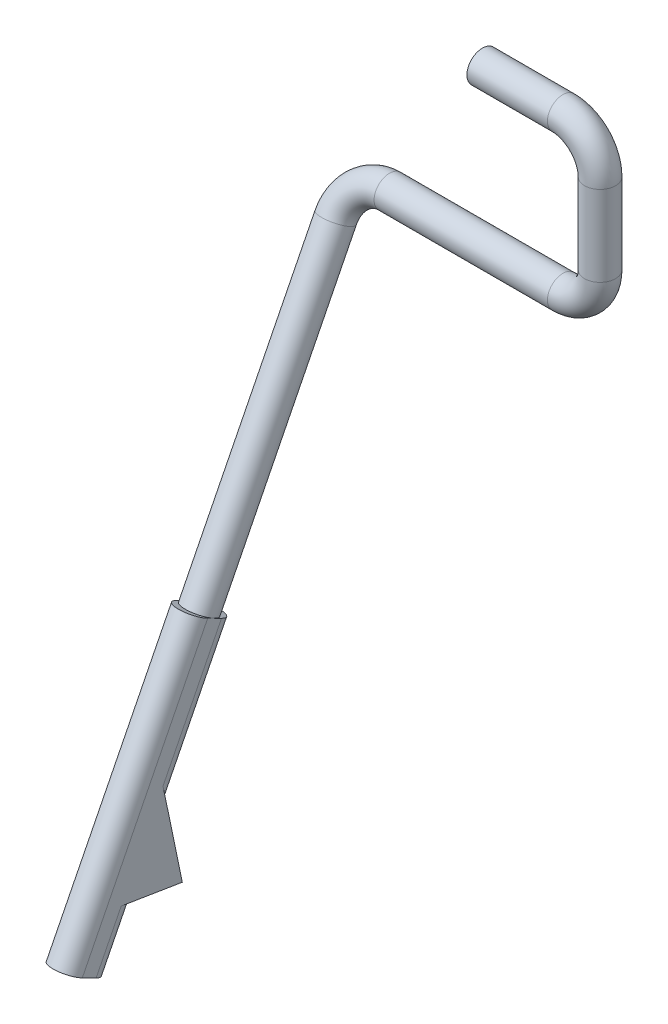
ISO-10303-21;
HEADER;
FILE_DESCRIPTION(('STEP AP214'),'2;1');
FILE_NAME('part.step','',(''),(''),'','','');
FILE_SCHEMA(('AUTOMOTIVE_DESIGN { 1 0 10303 214 1 1 1 1 }'));
ENDSEC;
DATA;
#1=APPLICATION_CONTEXT('core data for automotive mechanical design processes');
#2=APPLICATION_PROTOCOL_DEFINITION('international standard','automotive_design',2000,#1);
#3=PRODUCT_CONTEXT('',#1,'mechanical');
#4=PRODUCT('Part','Part','',(#3));
#5=PRODUCT_RELATED_PRODUCT_CATEGORY('part','',(#4));
#6=PRODUCT_DEFINITION_FORMATION('','',#4);
#7=PRODUCT_DEFINITION_CONTEXT('part definition',#1,'design');
#8=PRODUCT_DEFINITION('design','',#6,#7);
#9=PRODUCT_DEFINITION_SHAPE('','',#8);
#10=(LENGTH_UNIT() NAMED_UNIT(*) SI_UNIT(.MILLI.,.METRE.));
#11=(NAMED_UNIT(*) PLANE_ANGLE_UNIT() SI_UNIT($,.RADIAN.));
#12=(NAMED_UNIT(*) SI_UNIT($,.STERADIAN.) SOLID_ANGLE_UNIT());
#13=UNCERTAINTY_MEASURE_WITH_UNIT(LENGTH_MEASURE(1.E-05),#10,'distance_accuracy_value','');
#14=(GEOMETRIC_REPRESENTATION_CONTEXT(3) GLOBAL_UNCERTAINTY_ASSIGNED_CONTEXT((#13)) GLOBAL_UNIT_ASSIGNED_CONTEXT((#10,
#11,#12)) REPRESENTATION_CONTEXT('',''));
#15=CARTESIAN_POINT('',(0.,0.,0.));
#16=DIRECTION('',(0.,0.,1.));
#17=DIRECTION('',(1.,0.,0.));
#18=AXIS2_PLACEMENT_3D('',#15,#16,#17);
#19=CARTESIAN_POINT('',(-34.,-74.6790705236024,23.6337143062818));
#20=DIRECTION('',(0.,-0.893028554974588,0.45));
#21=DIRECTION('',(0.,-0.45,-0.893028554974588));
#22=AXIS2_PLACEMENT_3D('',#19,#20,#21);
#23=CYLINDRICAL_SURFACE('',#22,2.5);
#24=CARTESIAN_POINT('',(-34.,-106.828098502688,39.8337143062818));
#25=DIRECTION('',(0.,-0.987042804231733,0.160457167538121));
#26=DIRECTION('',(0.,0.160457167538121,0.987042804231733));
#27=AXIS2_PLACEMENT_3D('',#24,#25,#26);
#28=ELLIPSE('',#27,2.62147073680378,2.5);
#29=CARTESIAN_POINT('',(-31.5,-106.828098502688,39.8337143062818));
#30=VERTEX_POINT('',#29);
#31=CARTESIAN_POINT('',(-36.5,-106.828098502688,39.8337143062818));
#32=VERTEX_POINT('',#31);
#33=EDGE_CURVE('E11',#30,#32,#28,.F.);
#34=ORIENTED_EDGE('',*,*,#33,.F.);
#35=DIRECTION('',(0.,-0.893028554974588,0.45));
#36=VECTOR('',#35,1.);
#37=CARTESIAN_POINT('',(-31.5,-74.6790705236024,23.6337143062818));
#38=LINE('',#37,#36);
#39=CARTESIAN_POINT('',(-31.5,-114.865355497459,43.8837143062818));
#40=VERTEX_POINT('',#39);
#41=EDGE_CURVE('E185',#30,#40,#38,.T.);
#42=ORIENTED_EDGE('',*,*,#41,.T.);
#43=CARTESIAN_POINT('',(-34.,-114.865355497459,43.8837143062818));
#44=DIRECTION('',(0.,-0.893028554974587,0.450000000000001));
#45=DIRECTION('',(0.,-0.450000000000001,-0.893028554974587));
#46=AXIS2_PLACEMENT_3D('',#43,#44,#45);
#47=CIRCLE('',#46,2.5);
#48=CARTESIAN_POINT('',(-36.5,-114.865355497459,43.8837143062818));
#49=VERTEX_POINT('',#48);
#50=EDGE_CURVE('E178',#49,#40,#47,.T.);
#51=ORIENTED_EDGE('',*,*,#50,.F.);
#52=DIRECTION('',(0.,-0.893028554974588,0.45));
#53=VECTOR('',#52,1.);
#54=CARTESIAN_POINT('',(-36.5,-74.6790705236024,23.6337143062818));
#55=LINE('',#54,#53);
#56=EDGE_CURVE('E75',#32,#49,#55,.T.);
#57=ORIENTED_EDGE('',*,*,#56,.F.);
#58=EDGE_LOOP('',(#34,#42,#51,#57));
#59=FACE_BOUND('',#58,.T.);
#60=ADVANCED_FACE('F51',(#59),#23,.T.);
#61=CARTESIAN_POINT('',(-34.,-114.302855497459,45.));
#62=DIRECTION('',(0.,0.893028554974588,-0.45));
#63=DIRECTION('',(0.,0.45,0.893028554974588));
#64=AXIS2_PLACEMENT_3D('',#61,#62,#63);
#65=CYLINDRICAL_SURFACE('',#64,2.5);
#66=CARTESIAN_POINT('',(-34.,-30.3581713298475,2.70000000000001));
#67=DIRECTION('',(0.,-0.893028554974588,0.45));
#68=DIRECTION('',(-0.449999999999999,-0.401862849738565,-0.797500000000001));
#69=AXIS2_PLACEMENT_3D('',#66,#67,#68);
#70=CIRCLE('',#69,2.5);
#71=CARTESIAN_POINT('',(-36.5,-30.3581713298475,2.70000000000001));
#72=VERTEX_POINT('',#71);
#73=EDGE_CURVE('E184',#72,#72,#70,.T.);
#74=ORIENTED_EDGE('',*,*,#73,.T.);
#75=EDGE_LOOP('',(#74));
#76=FACE_BOUND('',#75,.T.);
#77=CARTESIAN_POINT('',(-34.,-74.1165705236024,24.75));
#78=DIRECTION('',(0.,-0.893028554974587,0.450000000000001));
#79=DIRECTION('',(0.,-0.450000000000001,-0.893028554974587));
#80=AXIS2_PLACEMENT_3D('',#77,#78,#79);
#81=CIRCLE('',#80,2.5);
#82=CARTESIAN_POINT('',(-31.5,-74.1165705236024,24.75));
#83=VERTEX_POINT('',#82);
#84=CARTESIAN_POINT('',(-36.5,-74.1165705236024,24.75));
#85=VERTEX_POINT('',#84);
#86=EDGE_CURVE('E223',#83,#85,#81,.T.);
#87=ORIENTED_EDGE('',*,*,#86,.F.);
#88=EDGE_CURVE('E220',#85,#83,#81,.T.);
#89=ORIENTED_EDGE('',*,*,#88,.F.);
#90=EDGE_LOOP('',(#87,#89));
#91=FACE_BOUND('',#90,.T.);
#92=ADVANCED_FACE('F288',(#76,#91),#65,.T.);
#93=CARTESIAN_POINT('',(-13.,0.,0.));
#94=DIRECTION('',(1.,0.,0.));
#95=DIRECTION('',(0.,0.,-1.));
#96=AXIS2_PLACEMENT_3D('',#93,#94,#95);
#97=PLANE('',#96);
#98=CARTESIAN_POINT('',(-13.,0.,0.));
#99=DIRECTION('',(1.,0.,0.));
#100=DIRECTION('',(0.,0.,-1.));
#101=AXIS2_PLACEMENT_3D('',#98,#99,#100);
#102=CIRCLE('',#101,2.5);
#103=CARTESIAN_POINT('',(-13.,0.,-2.5));
#104=VERTEX_POINT('',#103);
#105=EDGE_CURVE('E216',#104,#104,#102,.T.);
#106=ORIENTED_EDGE('',*,*,#105,.F.);
#107=EDGE_LOOP('',(#106));
#108=FACE_BOUND('',#107,.T.);
#109=ADVANCED_FACE('F295',(#108),#97,.F.);
#110=CARTESIAN_POINT('',(-28.,-30.3581713298475,2.7));
#111=DIRECTION('',(0.,-0.449999999999998,-0.893028554974588));
#112=DIRECTION('',(0.,0.893028554974589,-0.449999999999999));
#113=AXIS2_PLACEMENT_3D('',#110,#111,#112);
#114=TOROIDAL_SURFACE('',#113,6.,2.5);
#115=CARTESIAN_POINT('',(-28.,-25.,0.));
#116=DIRECTION('',(-1.,0.,0.));
#117=DIRECTION('',(0.,0.,-1.));
#118=AXIS2_PLACEMENT_3D('',#115,#116,#117);
#119=CIRCLE('',#118,2.5);
#120=CARTESIAN_POINT('',(-28.,-22.7674286125635,-1.12499999999998));
#121=VERTEX_POINT('',#120);
#122=EDGE_CURVE('E196',#121,#121,#119,.T.);
#123=CARTESIAN_POINT('',(-28.,-30.3581713298475,2.7));
#124=DIRECTION('',(0.,-0.449999999999998,-0.893028554974588));
#125=DIRECTION('',(0.,0.893028554974589,-0.449999999999999));
#126=AXIS2_PLACEMENT_3D('',#123,#124,#125);
#127=CIRCLE('',#126,8.5);
#128=EDGE_CURVE('',#72,#121,#127,.T.);
#129=ORIENTED_EDGE('',*,*,#73,.F.);
#130=ORIENTED_EDGE('',*,*,#122,.T.);
#131=ORIENTED_EDGE('',*,*,#128,.T.);
#132=ORIENTED_EDGE('',*,*,#128,.F.);
#133=EDGE_LOOP('',(#129,#131,#130,#132));
#134=FACE_BOUND('',#133,.T.);
#135=ADVANCED_FACE('F430',(#134),#114,.T.);
#136=CARTESIAN_POINT('',(-28.,-25.,0.));
#137=DIRECTION('',(1.,0.,0.));
#138=DIRECTION('',(0.,0.,-1.));
#139=AXIS2_PLACEMENT_3D('',#136,#137,#138);
#140=CYLINDRICAL_SURFACE('',#139,2.5);
#141=CARTESIAN_POINT('',(0.,-25.,0.));
#142=DIRECTION('',(-1.,0.,0.));
#143=DIRECTION('',(0.,0.,-1.));
#144=AXIS2_PLACEMENT_3D('',#141,#142,#143);
#145=CIRCLE('',#144,2.5);
#146=CARTESIAN_POINT('',(0.,-27.5,0.));
#147=VERTEX_POINT('',#146);
#148=EDGE_CURVE('E200',#147,#147,#145,.T.);
#149=ORIENTED_EDGE('',*,*,#148,.T.);
#150=EDGE_LOOP('',(#149));
#151=FACE_BOUND('',#150,.T.);
#152=ORIENTED_EDGE('',*,*,#122,.F.);
#153=EDGE_LOOP('',(#152));
#154=FACE_BOUND('',#153,.T.);
#155=ADVANCED_FACE('F421',(#151,#154),#140,.T.);
#156=CARTESIAN_POINT('',(0.,-19.,0.));
#157=DIRECTION('',(0.,0.,1.));
#158=DIRECTION('',(1.,0.,0.));
#159=AXIS2_PLACEMENT_3D('',#156,#157,#158);
#160=TOROIDAL_SURFACE('',#159,6.,2.5);
#161=CARTESIAN_POINT('',(6.,-19.,0.));
#162=DIRECTION('',(0.,-1.,0.));
#163=DIRECTION('',(0.,0.,-1.));
#164=AXIS2_PLACEMENT_3D('',#161,#162,#163);
#165=CIRCLE('',#164,2.5);
#166=CARTESIAN_POINT('',(8.5,-19.,0.));
#167=VERTEX_POINT('',#166);
#168=EDGE_CURVE('E204',#167,#167,#165,.T.);
#169=CARTESIAN_POINT('',(0.,-19.,0.));
#170=DIRECTION('',(0.,0.,1.));
#171=DIRECTION('',(1.,0.,0.));
#172=AXIS2_PLACEMENT_3D('',#169,#170,#171);
#173=CIRCLE('',#172,8.5);
#174=EDGE_CURVE('',#147,#167,#173,.T.);
#175=ORIENTED_EDGE('',*,*,#148,.F.);
#176=ORIENTED_EDGE('',*,*,#168,.T.);
#177=ORIENTED_EDGE('',*,*,#174,.T.);
#178=ORIENTED_EDGE('',*,*,#174,.F.);
#179=EDGE_LOOP('',(#175,#177,#176,#178));
#180=FACE_BOUND('',#179,.T.);
#181=ADVANCED_FACE('F412',(#180),#160,.T.);
#182=CARTESIAN_POINT('',(6.,-19.,0.));
#183=DIRECTION('',(0.,1.,0.));
#184=DIRECTION('',(0.,0.,1.));
#185=AXIS2_PLACEMENT_3D('',#182,#183,#184);
#186=CYLINDRICAL_SURFACE('',#185,2.5);
#187=CARTESIAN_POINT('',(6.,-6.,0.));
#188=DIRECTION('',(0.,-1.,0.));
#189=DIRECTION('',(0.,0.,-1.));
#190=AXIS2_PLACEMENT_3D('',#187,#188,#189);
#191=CIRCLE('',#190,2.5);
#192=CARTESIAN_POINT('',(8.5,-6.,0.));
#193=VERTEX_POINT('',#192);
#194=EDGE_CURVE('E208',#193,#193,#191,.T.);
#195=ORIENTED_EDGE('',*,*,#194,.T.);
#196=EDGE_LOOP('',(#195));
#197=FACE_BOUND('',#196,.T.);
#198=ORIENTED_EDGE('',*,*,#168,.F.);
#199=EDGE_LOOP('',(#198));
#200=FACE_BOUND('',#199,.T.);
#201=ADVANCED_FACE('F403',(#197,#200),#186,.T.);
#202=CARTESIAN_POINT('',(0.,-6.,0.));
#203=DIRECTION('',(0.,0.,1.));
#204=DIRECTION('',(1.,0.,0.));
#205=AXIS2_PLACEMENT_3D('',#202,#203,#204);
#206=TOROIDAL_SURFACE('',#205,6.,2.5);
#207=CARTESIAN_POINT('',(0.,0.,0.));
#208=DIRECTION('',(1.,0.,0.));
#209=DIRECTION('',(0.,0.,-1.));
#210=AXIS2_PLACEMENT_3D('',#207,#208,#209);
#211=CIRCLE('',#210,2.5);
#212=CARTESIAN_POINT('',(0.,2.5,0.));
#213=VERTEX_POINT('',#212);
#214=EDGE_CURVE('E212',#213,#213,#211,.T.);
#215=CARTESIAN_POINT('',(0.,-6.,0.));
#216=DIRECTION('',(0.,0.,1.));
#217=DIRECTION('',(1.,0.,0.));
#218=AXIS2_PLACEMENT_3D('',#215,#216,#217);
#219=CIRCLE('',#218,8.5);
#220=EDGE_CURVE('',#193,#213,#219,.T.);
#221=ORIENTED_EDGE('',*,*,#194,.F.);
#222=ORIENTED_EDGE('',*,*,#214,.T.);
#223=ORIENTED_EDGE('',*,*,#220,.T.);
#224=ORIENTED_EDGE('',*,*,#220,.F.);
#225=EDGE_LOOP('',(#221,#223,#222,#224));
#226=FACE_BOUND('',#225,.T.);
#227=ADVANCED_FACE('F394',(#226),#206,.T.);
#228=CARTESIAN_POINT('',(0.,0.,0.));
#229=DIRECTION('',(-1.,0.,0.));
#230=DIRECTION('',(0.,-1.,0.));
#231=AXIS2_PLACEMENT_3D('',#228,#229,#230);
#232=CYLINDRICAL_SURFACE('',#231,2.5);
#233=ORIENTED_EDGE('',*,*,#105,.T.);
#234=EDGE_LOOP('',(#233));
#235=FACE_BOUND('',#234,.T.);
#236=ORIENTED_EDGE('',*,*,#214,.F.);
#237=EDGE_LOOP('',(#236));
#238=FACE_BOUND('',#237,.T.);
#239=ADVANCED_FACE('F298',(#235,#238),#232,.T.);
#240=CARTESIAN_POINT('',(-31.5,-69.0540705236023,34.7965712434642));
#241=DIRECTION('',(-1.,0.,0.));
#242=DIRECTION('',(0.,-1.,0.));
#243=AXIS2_PLACEMENT_3D('',#240,#241,#242);
#244=PLANE('',#243);
#245=DIRECTION('',(0.,-0.450000000000001,-0.893028554974587));
#246=VECTOR('',#245,1.);
#247=CARTESIAN_POINT('',(-31.5,-109.240355497459,55.0465712434642));
#248=LINE('',#247,#246);
#249=CARTESIAN_POINT('',(-31.5,-113.740355497459,46.1162856937183));
#250=VERTEX_POINT('',#249);
#251=EDGE_CURVE('E129',#250,#40,#248,.T.);
#252=ORIENTED_EDGE('',*,*,#251,.T.);
#253=ORIENTED_EDGE('',*,*,#41,.F.);
#254=DIRECTION('',(0.,-0.160457167538121,-0.987042804231733));
#255=VECTOR('',#254,1.);
#256=CARTESIAN_POINT('',(-31.5,-106.828098502688,39.8337143062818));
#257=LINE('',#256,#255);
#258=CARTESIAN_POINT('',(-31.5,-108.432670178069,29.9632862639644));
#259=VERTEX_POINT('',#258);
#260=EDGE_CURVE('E146',#30,#259,#257,.T.);
#261=ORIENTED_EDGE('',*,*,#260,.T.);
#262=DIRECTION('',(0.,0.979039960382317,0.203668249795082));
#263=VECTOR('',#262,1.);
#264=CARTESIAN_POINT('',(-31.5,-108.432670178069,29.9632862639644));
#265=LINE('',#264,#263);
#266=CARTESIAN_POINT('',(-31.5,-93.4326701780687,33.0837143062818));
#267=VERTEX_POINT('',#266);
#268=EDGE_CURVE('E135',#259,#267,#265,.T.);
#269=ORIENTED_EDGE('',*,*,#268,.T.);
#270=CARTESIAN_POINT('',(-31.5,-74.6790705236024,23.6337143062818));
#271=VERTEX_POINT('',#270);
#272=EDGE_CURVE('E67',#271,#267,#38,.T.);
#273=ORIENTED_EDGE('',*,*,#272,.F.);
#274=DIRECTION('',(0.,-0.450000000000001,-0.893028554974587));
#275=VECTOR('',#274,1.);
#276=CARTESIAN_POINT('',(-31.5,-69.0540705236023,34.7965712434642));
#277=LINE('',#276,#275);
#278=EDGE_CURVE('E155',#83,#271,#277,.T.);
#279=ORIENTED_EDGE('',*,*,#278,.F.);
#280=CARTESIAN_POINT('',(-31.5,-73.5540705236024,25.8662856937183));
#281=VERTEX_POINT('',#280);
#282=EDGE_CURVE('E150',#281,#83,#277,.T.);
#283=ORIENTED_EDGE('',*,*,#282,.F.);
#284=DIRECTION('',(0.,-0.893028554974588,0.45));
#285=VECTOR('',#284,1.);
#286=CARTESIAN_POINT('',(-31.5,-73.5540705236024,25.8662856937183));
#287=LINE('',#286,#285);
#288=EDGE_CURVE('E166',#281,#250,#287,.T.);
#289=ORIENTED_EDGE('',*,*,#288,.T.);
#290=EDGE_LOOP('',(#252,#253,#261,#269,#273,#279,#283,#289));
#291=FACE_BOUND('',#290,.T.);
#292=ADVANCED_FACE('F247',(#291),#244,.F.);
#293=CARTESIAN_POINT('',(-36.5,-69.0540705236023,34.7965712434642));
#294=DIRECTION('',(-1.,0.,0.));
#295=DIRECTION('',(0.,-1.,0.));
#296=AXIS2_PLACEMENT_3D('',#293,#294,#295);
#297=PLANE('',#296);
#298=DIRECTION('',(0.,-0.450000000000001,-0.893028554974587));
#299=VECTOR('',#298,1.);
#300=CARTESIAN_POINT('',(-36.5,-69.0540705236023,34.7965712434642));
#301=LINE('',#300,#299);
#302=CARTESIAN_POINT('',(-36.5,-73.5540705236024,25.8662856937183));
#303=VERTEX_POINT('',#302);
#304=EDGE_CURVE('E160',#303,#85,#301,.T.);
#305=ORIENTED_EDGE('',*,*,#304,.T.);
#306=CARTESIAN_POINT('',(-36.5,-74.6790705236024,23.6337143062818));
#307=VERTEX_POINT('',#306);
#308=EDGE_CURVE('E159',#85,#307,#301,.T.);
#309=ORIENTED_EDGE('',*,*,#308,.T.);
#310=CARTESIAN_POINT('',(-36.5,-93.4326701780687,33.0837143062818));
#311=VERTEX_POINT('',#310);
#312=EDGE_CURVE('E126',#307,#311,#55,.T.);
#313=ORIENTED_EDGE('',*,*,#312,.T.);
#314=DIRECTION('',(0.,0.979039960382317,0.203668249795082));
#315=VECTOR('',#314,1.);
#316=CARTESIAN_POINT('',(-36.5,-108.432670178069,29.9632862639644));
#317=LINE('',#316,#315);
#318=CARTESIAN_POINT('',(-36.5,-108.432670178069,29.9632862639644));
#319=VERTEX_POINT('',#318);
#320=EDGE_CURVE('E119',#319,#311,#317,.T.);
#321=ORIENTED_EDGE('',*,*,#320,.F.);
#322=DIRECTION('',(0.,-0.160457167538121,-0.987042804231733));
#323=VECTOR('',#322,1.);
#324=CARTESIAN_POINT('',(-36.5,-106.828098502688,39.8337143062818));
#325=LINE('',#324,#323);
#326=EDGE_CURVE('E124',#32,#319,#325,.T.);
#327=ORIENTED_EDGE('',*,*,#326,.F.);
#328=ORIENTED_EDGE('',*,*,#56,.T.);
#329=DIRECTION('',(0.,-0.450000000000001,-0.893028554974587));
#330=VECTOR('',#329,1.);
#331=CARTESIAN_POINT('',(-36.5,-109.240355497459,55.0465712434642));
#332=LINE('',#331,#330);
#333=CARTESIAN_POINT('',(-36.5,-113.740355497459,46.1162856937183));
#334=VERTEX_POINT('',#333);
#335=EDGE_CURVE('E174',#334,#49,#332,.T.);
#336=ORIENTED_EDGE('',*,*,#335,.F.);
#337=DIRECTION('',(0.,-0.893028554974588,0.45));
#338=VECTOR('',#337,1.);
#339=CARTESIAN_POINT('',(-36.5,-73.5540705236024,25.8662856937183));
#340=LINE('',#339,#338);
#341=EDGE_CURVE('E188',#303,#334,#340,.T.);
#342=ORIENTED_EDGE('',*,*,#341,.F.);
#343=EDGE_LOOP('',(#305,#309,#313,#321,#327,#328,#336,#342));
#344=FACE_BOUND('',#343,.T.);
#345=ADVANCED_FACE('F122',(#344),#297,.T.);
#346=CARTESIAN_POINT('',(0.,-69.0540705236023,34.7965712434642));
#347=DIRECTION('',(0.,-0.893028554974587,0.450000000000001));
#348=DIRECTION('',(0.,-0.450000000000001,-0.893028554974587));
#349=AXIS2_PLACEMENT_3D('',#346,#347,#348);
#350=PLANE('',#349);
#351=ORIENTED_EDGE('',*,*,#282,.T.);
#352=ORIENTED_EDGE('',*,*,#86,.T.);
#353=ORIENTED_EDGE('',*,*,#304,.F.);
#354=CARTESIAN_POINT('',(-34.,-73.5540705236024,25.8662856937183));
#355=DIRECTION('',(0.,-0.893028554974587,0.450000000000001));
#356=DIRECTION('',(0.,-0.450000000000001,-0.893028554974587));
#357=AXIS2_PLACEMENT_3D('',#354,#355,#356);
#358=CIRCLE('',#357,2.5);
#359=EDGE_CURVE('E154',#281,#303,#358,.T.);
#360=ORIENTED_EDGE('',*,*,#359,.F.);
#361=EDGE_LOOP('',(#351,#352,#353,#360));
#362=FACE_BOUND('',#361,.T.);
#363=ADVANCED_FACE('F232',(#362),#350,.F.);
#364=CARTESIAN_POINT('',(-34.,-93.4326701780687,33.0837143062818));
#365=DIRECTION('',(0.,0.203668249795082,-0.979039960382317));
#366=DIRECTION('',(0.,-0.979039960382317,-0.203668249795082));
#367=AXIS2_PLACEMENT_3D('',#364,#365,#366);
#368=ELLIPSE('',#367,4.01638979441671,2.5);
#369=EDGE_CURVE('E60',#311,#267,#368,.F.);
#370=ORIENTED_EDGE('',*,*,#369,.F.);
#371=ORIENTED_EDGE('',*,*,#312,.F.);
#372=CARTESIAN_POINT('',(-34.,-74.6790705236024,23.6337143062818));
#373=DIRECTION('',(0.,-0.893028554974587,0.450000000000001));
#374=DIRECTION('',(0.,-0.450000000000001,-0.893028554974587));
#375=AXIS2_PLACEMENT_3D('',#372,#373,#374);
#376=CIRCLE('',#375,2.5);
#377=EDGE_CURVE('E163',#307,#271,#376,.T.);
#378=ORIENTED_EDGE('',*,*,#377,.T.);
#379=ORIENTED_EDGE('',*,*,#272,.T.);
#380=EDGE_LOOP('',(#370,#371,#378,#379));
#381=FACE_BOUND('',#380,.T.);
#382=ADVANCED_FACE('F290',(#381),#23,.T.);
#383=CARTESIAN_POINT('',(-34.,-73.5540705236024,25.8662856937183));
#384=DIRECTION('',(0.,-0.893028554974588,0.45));
#385=DIRECTION('',(0.,-0.45,-0.893028554974588));
#386=AXIS2_PLACEMENT_3D('',#383,#384,#385);
#387=CYLINDRICAL_SURFACE('',#386,2.5);
#388=CARTESIAN_POINT('',(-34.,-113.740355497459,46.1162856937183));
#389=DIRECTION('',(0.,-0.893028554974587,0.450000000000001));
#390=DIRECTION('',(0.,-0.450000000000001,-0.893028554974587));
#391=AXIS2_PLACEMENT_3D('',#388,#389,#390);
#392=CIRCLE('',#391,2.5);
#393=EDGE_CURVE('E170',#250,#334,#392,.T.);
#394=ORIENTED_EDGE('',*,*,#393,.F.);
#395=ORIENTED_EDGE('',*,*,#288,.F.);
#396=ORIENTED_EDGE('',*,*,#359,.T.);
#397=ORIENTED_EDGE('',*,*,#341,.T.);
#398=EDGE_LOOP('',(#394,#395,#396,#397));
#399=FACE_BOUND('',#398,.T.);
#400=ADVANCED_FACE('F244',(#399),#387,.T.);
#401=ORIENTED_EDGE('',*,*,#308,.F.);
#402=ORIENTED_EDGE('',*,*,#88,.T.);
#403=ORIENTED_EDGE('',*,*,#278,.T.);
#404=ORIENTED_EDGE('',*,*,#377,.F.);
#405=EDGE_LOOP('',(#401,#402,#403,#404));
#406=FACE_BOUND('',#405,.T.);
#407=ADVANCED_FACE('F238',(#406),#350,.F.);
#408=CARTESIAN_POINT('',(-34.,-114.302855497459,45.));
#409=DIRECTION('',(0.,-0.893028554974588,0.45));
#410=DIRECTION('',(-0.449999999999999,-0.401862849738565,-0.797500000000001));
#411=AXIS2_PLACEMENT_3D('',#408,#409,#410);
#412=PLANE('',#411);
#413=ORIENTED_EDGE('',*,*,#50,.T.);
#414=ORIENTED_EDGE('',*,*,#251,.F.);
#415=ORIENTED_EDGE('',*,*,#393,.T.);
#416=ORIENTED_EDGE('',*,*,#335,.T.);
#417=EDGE_LOOP('',(#413,#414,#415,#416));
#418=FACE_BOUND('',#417,.T.);
#419=ADVANCED_FACE('F53',(#418),#412,.T.);
#420=CARTESIAN_POINT('',(-54.4562064406312,-106.828098502688,39.8337143062818));
#421=DIRECTION('',(0.,-0.987042804231733,0.160457167538121));
#422=DIRECTION('',(0.,-0.160457167538121,-0.987042804231733));
#423=AXIS2_PLACEMENT_3D('',#420,#421,#422);
#424=PLANE('',#423);
#425=ORIENTED_EDGE('',*,*,#260,.F.);
#426=ORIENTED_EDGE('',*,*,#33,.T.);
#427=ORIENTED_EDGE('',*,*,#326,.T.);
#428=DIRECTION('',(1.,0.,0.));
#429=VECTOR('',#428,1.);
#430=CARTESIAN_POINT('',(-54.4562064406312,-108.432670178069,29.9632862639644));
#431=LINE('',#430,#429);
#432=EDGE_CURVE('E130',#319,#259,#431,.T.);
#433=ORIENTED_EDGE('',*,*,#432,.T.);
#434=EDGE_LOOP('',(#425,#426,#427,#433));
#435=FACE_BOUND('',#434,.T.);
#436=ADVANCED_FACE('F141',(#435),#424,.T.);
#437=CARTESIAN_POINT('',(-54.4562064406312,-108.432670178069,29.9632862639644));
#438=DIRECTION('',(0.,0.203668249795082,-0.979039960382317));
#439=DIRECTION('',(0.,0.979039960382317,0.203668249795082));
#440=AXIS2_PLACEMENT_3D('',#437,#438,#439);
#441=PLANE('',#440);
#442=ORIENTED_EDGE('',*,*,#320,.T.);
#443=ORIENTED_EDGE('',*,*,#369,.T.);
#444=ORIENTED_EDGE('',*,*,#268,.F.);
#445=ORIENTED_EDGE('',*,*,#432,.F.);
#446=EDGE_LOOP('',(#442,#443,#444,#445));
#447=FACE_BOUND('',#446,.T.);
#448=ADVANCED_FACE('F133',(#447),#441,.T.);
#449=CLOSED_SHELL('',(#60,#92,#109,#135,#155,#181,#201,#227,#239,#292,#345,#363,#382,#400,#407,
#419,#436,#448));
#450=MANIFOLD_SOLID_BREP('B2',#449);
#451=ADVANCED_BREP_SHAPE_REPRESENTATION('',(#18,#450),#14);
#452=SHAPE_DEFINITION_REPRESENTATION(#9,#451);
ENDSEC;
END-ISO-10303-21;
